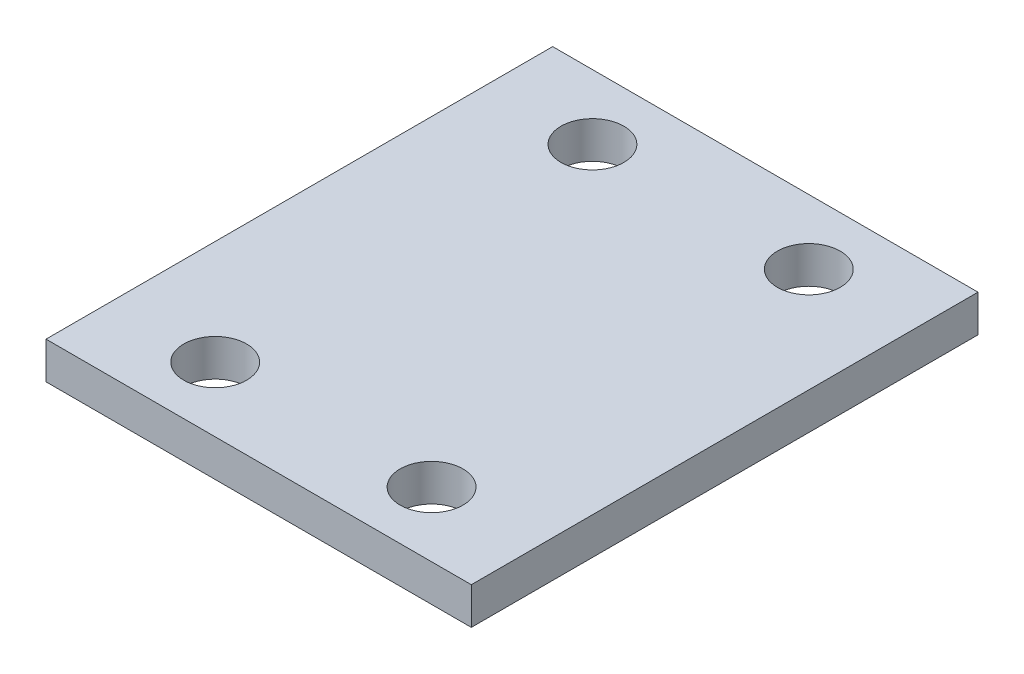
ISO-10303-21;
HEADER;
FILE_DESCRIPTION(('STEP AP214'),'2;1');
FILE_NAME('part.step','',(''),(''),'','','');
FILE_SCHEMA(('AUTOMOTIVE_DESIGN { 1 0 10303 214 1 1 1 1 }'));
ENDSEC;
DATA;
#1=APPLICATION_CONTEXT('core data for automotive mechanical design processes');
#2=APPLICATION_PROTOCOL_DEFINITION('international standard','automotive_design',2000,#1);
#3=PRODUCT_CONTEXT('',#1,'mechanical');
#4=PRODUCT('Part','Part','',(#3));
#5=PRODUCT_RELATED_PRODUCT_CATEGORY('part','',(#4));
#6=PRODUCT_DEFINITION_FORMATION('','',#4);
#7=PRODUCT_DEFINITION_CONTEXT('part definition',#1,'design');
#8=PRODUCT_DEFINITION('design','',#6,#7);
#9=PRODUCT_DEFINITION_SHAPE('','',#8);
#10=(LENGTH_UNIT() NAMED_UNIT(*) SI_UNIT(.MILLI.,.METRE.));
#11=(NAMED_UNIT(*) PLANE_ANGLE_UNIT() SI_UNIT($,.RADIAN.));
#12=(NAMED_UNIT(*) SI_UNIT($,.STERADIAN.) SOLID_ANGLE_UNIT());
#13=UNCERTAINTY_MEASURE_WITH_UNIT(LENGTH_MEASURE(1.E-05),#10,'distance_accuracy_value','');
#14=(GEOMETRIC_REPRESENTATION_CONTEXT(3) GLOBAL_UNCERTAINTY_ASSIGNED_CONTEXT((#13)) GLOBAL_UNIT_ASSIGNED_CONTEXT((#10,
#11,#12)) REPRESENTATION_CONTEXT('',''));
#15=CARTESIAN_POINT('',(0.,0.,0.));
#16=DIRECTION('',(0.,0.,1.));
#17=DIRECTION('',(1.,0.,0.));
#18=AXIS2_PLACEMENT_3D('',#15,#16,#17);
#19=CARTESIAN_POINT('',(11.5,-2.,0.));
#20=DIRECTION('',(-1.,0.,0.));
#21=DIRECTION('',(0.,0.,1.));
#22=AXIS2_PLACEMENT_3D('',#19,#20,#21);
#23=PLANE('',#22);
#24=DIRECTION('',(0.,0.,1.));
#25=VECTOR('',#24,1.);
#26=CARTESIAN_POINT('',(11.5,0.,0.));
#27=LINE('',#26,#25);
#28=CARTESIAN_POINT('',(11.5,0.,-13.7));
#29=VERTEX_POINT('',#28);
#30=CARTESIAN_POINT('',(11.5,0.,13.7));
#31=VERTEX_POINT('',#30);
#32=EDGE_CURVE('E127',#29,#31,#27,.T.);
#33=ORIENTED_EDGE('',*,*,#32,.T.);
#34=DIRECTION('',(0.,1.,0.));
#35=VECTOR('',#34,1.);
#36=CARTESIAN_POINT('',(11.5,-2.,13.7));
#37=LINE('',#36,#35);
#38=CARTESIAN_POINT('',(11.5,-2.,13.7));
#39=VERTEX_POINT('',#38);
#40=EDGE_CURVE('E11',#39,#31,#37,.T.);
#41=ORIENTED_EDGE('',*,*,#40,.F.);
#42=DIRECTION('',(0.,0.,1.));
#43=VECTOR('',#42,1.);
#44=CARTESIAN_POINT('',(11.5,-2.,0.));
#45=LINE('',#44,#43);
#46=CARTESIAN_POINT('',(11.5,-2.,-13.7));
#47=VERTEX_POINT('',#46);
#48=EDGE_CURVE('E62',#47,#39,#45,.T.);
#49=ORIENTED_EDGE('',*,*,#48,.F.);
#50=DIRECTION('',(0.,1.,0.));
#51=VECTOR('',#50,1.);
#52=CARTESIAN_POINT('',(11.5,-2.,-13.7));
#53=LINE('',#52,#51);
#54=EDGE_CURVE('E47',#47,#29,#53,.T.);
#55=ORIENTED_EDGE('',*,*,#54,.T.);
#56=EDGE_LOOP('',(#33,#41,#49,#55));
#57=FACE_BOUND('',#56,.T.);
#58=ADVANCED_FACE('F43',(#57),#23,.F.);
#59=CARTESIAN_POINT('',(0.,-2.,13.7));
#60=DIRECTION('',(0.,0.,1.));
#61=DIRECTION('',(1.,0.,0.));
#62=AXIS2_PLACEMENT_3D('',#59,#60,#61);
#63=PLANE('',#62);
#64=DIRECTION('',(1.,0.,0.));
#65=VECTOR('',#64,1.);
#66=CARTESIAN_POINT('',(0.,0.,13.7));
#67=LINE('',#66,#65);
#68=CARTESIAN_POINT('',(-11.5,0.,13.7));
#69=VERTEX_POINT('',#68);
#70=EDGE_CURVE('E135',#69,#31,#67,.T.);
#71=ORIENTED_EDGE('',*,*,#70,.F.);
#72=DIRECTION('',(0.,1.,0.));
#73=VECTOR('',#72,1.);
#74=CARTESIAN_POINT('',(-11.5,-2.,13.7));
#75=LINE('',#74,#73);
#76=CARTESIAN_POINT('',(-11.5,-2.,13.7));
#77=VERTEX_POINT('',#76);
#78=EDGE_CURVE('E53',#77,#69,#75,.T.);
#79=ORIENTED_EDGE('',*,*,#78,.F.);
#80=DIRECTION('',(1.,0.,0.));
#81=VECTOR('',#80,1.);
#82=CARTESIAN_POINT('',(0.,-2.,13.7));
#83=LINE('',#82,#81);
#84=EDGE_CURVE('E106',#77,#39,#83,.T.);
#85=ORIENTED_EDGE('',*,*,#84,.T.);
#86=ORIENTED_EDGE('',*,*,#40,.T.);
#87=EDGE_LOOP('',(#71,#79,#85,#86));
#88=FACE_BOUND('',#87,.T.);
#89=ADVANCED_FACE('F182',(#88),#63,.T.);
#90=CARTESIAN_POINT('',(-11.5,-2.,0.));
#91=DIRECTION('',(-1.,0.,0.));
#92=DIRECTION('',(0.,0.,1.));
#93=AXIS2_PLACEMENT_3D('',#90,#91,#92);
#94=PLANE('',#93);
#95=DIRECTION('',(0.,0.,1.));
#96=VECTOR('',#95,1.);
#97=CARTESIAN_POINT('',(-11.5,0.,0.));
#98=LINE('',#97,#96);
#99=CARTESIAN_POINT('',(-11.5,0.,-13.7));
#100=VERTEX_POINT('',#99);
#101=EDGE_CURVE('E96',#100,#69,#98,.T.);
#102=ORIENTED_EDGE('',*,*,#101,.F.);
#103=DIRECTION('',(0.,1.,0.));
#104=VECTOR('',#103,1.);
#105=CARTESIAN_POINT('',(-11.5,-2.,-13.7));
#106=LINE('',#105,#104);
#107=CARTESIAN_POINT('',(-11.5,-2.,-13.7));
#108=VERTEX_POINT('',#107);
#109=EDGE_CURVE('E93',#108,#100,#106,.T.);
#110=ORIENTED_EDGE('',*,*,#109,.F.);
#111=DIRECTION('',(0.,0.,1.));
#112=VECTOR('',#111,1.);
#113=CARTESIAN_POINT('',(-11.5,-2.,0.));
#114=LINE('',#113,#112);
#115=EDGE_CURVE('E95',#108,#77,#114,.T.);
#116=ORIENTED_EDGE('',*,*,#115,.T.);
#117=ORIENTED_EDGE('',*,*,#78,.T.);
#118=EDGE_LOOP('',(#102,#110,#116,#117));
#119=FACE_BOUND('',#118,.T.);
#120=ADVANCED_FACE('F94',(#119),#94,.T.);
#121=CARTESIAN_POINT('',(5.84999999999998,-2.,10.2));
#122=DIRECTION('',(0.,1.,0.));
#123=DIRECTION('',(0.,0.,1.));
#124=AXIS2_PLACEMENT_3D('',#121,#122,#123);
#125=CYLINDRICAL_SURFACE('',#124,1.7);
#126=CARTESIAN_POINT('',(5.84999999999998,-2.,10.2));
#127=DIRECTION('',(0.,1.,0.));
#128=DIRECTION('',(0.,0.,1.));
#129=AXIS2_PLACEMENT_3D('',#126,#127,#128);
#130=CIRCLE('',#129,1.7);
#131=CARTESIAN_POINT('',(5.84999999999998,-2.,11.9));
#132=VERTEX_POINT('',#131);
#133=EDGE_CURVE('E110',#132,#132,#130,.T.);
#134=ORIENTED_EDGE('',*,*,#133,.F.);
#135=EDGE_LOOP('',(#134));
#136=FACE_BOUND('',#135,.T.);
#137=CARTESIAN_POINT('',(5.84999999999998,0.,10.2));
#138=DIRECTION('',(0.,1.,0.));
#139=DIRECTION('',(0.,0.,1.));
#140=AXIS2_PLACEMENT_3D('',#137,#138,#139);
#141=CIRCLE('',#140,1.7);
#142=CARTESIAN_POINT('',(5.84999999999998,0.,11.9));
#143=VERTEX_POINT('',#142);
#144=EDGE_CURVE('E138',#143,#143,#141,.T.);
#145=ORIENTED_EDGE('',*,*,#144,.T.);
#146=EDGE_LOOP('',(#145));
#147=FACE_BOUND('',#146,.T.);
#148=ADVANCED_FACE('F173',(#136,#147),#125,.F.);
#149=CARTESIAN_POINT('',(0.,-2.,-13.7));
#150=DIRECTION('',(0.,0.,1.));
#151=DIRECTION('',(1.,0.,0.));
#152=AXIS2_PLACEMENT_3D('',#149,#150,#151);
#153=PLANE('',#152);
#154=DIRECTION('',(1.,0.,0.));
#155=VECTOR('',#154,1.);
#156=CARTESIAN_POINT('',(0.,0.,-13.7));
#157=LINE('',#156,#155);
#158=EDGE_CURVE('E130',#100,#29,#157,.T.);
#159=ORIENTED_EDGE('',*,*,#158,.T.);
#160=ORIENTED_EDGE('',*,*,#54,.F.);
#161=DIRECTION('',(1.,0.,0.));
#162=VECTOR('',#161,1.);
#163=CARTESIAN_POINT('',(0.,-2.,-13.7));
#164=LINE('',#163,#162);
#165=EDGE_CURVE('E89',#108,#47,#164,.T.);
#166=ORIENTED_EDGE('',*,*,#165,.F.);
#167=ORIENTED_EDGE('',*,*,#109,.T.);
#168=EDGE_LOOP('',(#159,#160,#166,#167));
#169=FACE_BOUND('',#168,.T.);
#170=ADVANCED_FACE('F100',(#169),#153,.F.);
#171=CARTESIAN_POINT('',(-5.85,-2.,-10.2));
#172=DIRECTION('',(0.,1.,0.));
#173=DIRECTION('',(0.,0.,1.));
#174=AXIS2_PLACEMENT_3D('',#171,#172,#173);
#175=CYLINDRICAL_SURFACE('',#174,1.7);
#176=CARTESIAN_POINT('',(-5.85,-2.,-10.2));
#177=DIRECTION('',(0.,1.,0.));
#178=DIRECTION('',(0.,0.,1.));
#179=AXIS2_PLACEMENT_3D('',#176,#177,#178);
#180=CIRCLE('',#179,1.7);
#181=CARTESIAN_POINT('',(-5.85,-2.,-8.5));
#182=VERTEX_POINT('',#181);
#183=EDGE_CURVE('E149',#182,#182,#180,.T.);
#184=ORIENTED_EDGE('',*,*,#183,.F.);
#185=EDGE_LOOP('',(#184));
#186=FACE_BOUND('',#185,.T.);
#187=CARTESIAN_POINT('',(-5.85,0.,-10.2));
#188=DIRECTION('',(0.,1.,0.));
#189=DIRECTION('',(0.,0.,1.));
#190=AXIS2_PLACEMENT_3D('',#187,#188,#189);
#191=CIRCLE('',#190,1.7);
#192=CARTESIAN_POINT('',(-5.85,0.,-8.5));
#193=VERTEX_POINT('',#192);
#194=EDGE_CURVE('E123',#193,#193,#191,.T.);
#195=ORIENTED_EDGE('',*,*,#194,.T.);
#196=EDGE_LOOP('',(#195));
#197=FACE_BOUND('',#196,.T.);
#198=ADVANCED_FACE('F159',(#186,#197),#175,.F.);
#199=CARTESIAN_POINT('',(5.84999999999999,-2.,-10.2));
#200=DIRECTION('',(0.,1.,0.));
#201=DIRECTION('',(0.,0.,1.));
#202=AXIS2_PLACEMENT_3D('',#199,#200,#201);
#203=CYLINDRICAL_SURFACE('',#202,1.7);
#204=CARTESIAN_POINT('',(5.84999999999999,-2.,-10.2));
#205=DIRECTION('',(0.,1.,0.));
#206=DIRECTION('',(0.,0.,1.));
#207=AXIS2_PLACEMENT_3D('',#204,#205,#206);
#208=CIRCLE('',#207,1.7);
#209=CARTESIAN_POINT('',(5.84999999999999,-2.,-8.49999999999999));
#210=VERTEX_POINT('',#209);
#211=EDGE_CURVE('E143',#210,#210,#208,.F.);
#212=ORIENTED_EDGE('',*,*,#211,.T.);
#213=EDGE_LOOP('',(#212));
#214=FACE_BOUND('',#213,.T.);
#215=CARTESIAN_POINT('',(5.84999999999999,0.,-10.2));
#216=DIRECTION('',(0.,1.,0.));
#217=DIRECTION('',(0.,0.,1.));
#218=AXIS2_PLACEMENT_3D('',#215,#216,#217);
#219=CIRCLE('',#218,1.7);
#220=CARTESIAN_POINT('',(5.84999999999999,0.,-8.49999999999999));
#221=VERTEX_POINT('',#220);
#222=EDGE_CURVE('E119',#221,#221,#219,.F.);
#223=ORIENTED_EDGE('',*,*,#222,.F.);
#224=EDGE_LOOP('',(#223));
#225=FACE_BOUND('',#224,.T.);
#226=ADVANCED_FACE('F45',(#214,#225),#203,.F.);
#227=CARTESIAN_POINT('',(-5.85000000000001,-2.,10.2));
#228=DIRECTION('',(0.,1.,0.));
#229=DIRECTION('',(0.,0.,1.));
#230=AXIS2_PLACEMENT_3D('',#227,#228,#229);
#231=CYLINDRICAL_SURFACE('',#230,1.7);
#232=CARTESIAN_POINT('',(-5.85000000000001,-2.,10.2));
#233=DIRECTION('',(0.,1.,0.));
#234=DIRECTION('',(0.,0.,1.));
#235=AXIS2_PLACEMENT_3D('',#232,#233,#234);
#236=CIRCLE('',#235,1.7);
#237=CARTESIAN_POINT('',(-5.85000000000001,-2.,11.9));
#238=VERTEX_POINT('',#237);
#239=EDGE_CURVE('E116',#238,#238,#236,.F.);
#240=ORIENTED_EDGE('',*,*,#239,.T.);
#241=EDGE_LOOP('',(#240));
#242=FACE_BOUND('',#241,.T.);
#243=CARTESIAN_POINT('',(-5.85000000000001,0.,10.2));
#244=DIRECTION('',(0.,1.,0.));
#245=DIRECTION('',(0.,0.,1.));
#246=AXIS2_PLACEMENT_3D('',#243,#244,#245);
#247=CIRCLE('',#246,1.7);
#248=CARTESIAN_POINT('',(-5.85000000000001,0.,11.9));
#249=VERTEX_POINT('',#248);
#250=EDGE_CURVE('E141',#249,#249,#247,.F.);
#251=ORIENTED_EDGE('',*,*,#250,.F.);
#252=EDGE_LOOP('',(#251));
#253=FACE_BOUND('',#252,.T.);
#254=ADVANCED_FACE('F229',(#242,#253),#231,.F.);
#255=CARTESIAN_POINT('',(0.,-2.,0.));
#256=DIRECTION('',(0.,1.,0.));
#257=DIRECTION('',(0.,0.,1.));
#258=AXIS2_PLACEMENT_3D('',#255,#256,#257);
#259=PLANE('',#258);
#260=ORIENTED_EDGE('',*,*,#211,.F.);
#261=EDGE_LOOP('',(#260));
#262=FACE_BOUND('',#261,.T.);
#263=ORIENTED_EDGE('',*,*,#183,.T.);
#264=EDGE_LOOP('',(#263));
#265=FACE_BOUND('',#264,.T.);
#266=ORIENTED_EDGE('',*,*,#48,.T.);
#267=ORIENTED_EDGE('',*,*,#84,.F.);
#268=ORIENTED_EDGE('',*,*,#115,.F.);
#269=ORIENTED_EDGE('',*,*,#165,.T.);
#270=EDGE_LOOP('',(#266,#267,#268,#269));
#271=FACE_BOUND('',#270,.T.);
#272=ORIENTED_EDGE('',*,*,#133,.T.);
#273=EDGE_LOOP('',(#272));
#274=FACE_BOUND('',#273,.T.);
#275=ORIENTED_EDGE('',*,*,#239,.F.);
#276=EDGE_LOOP('',(#275));
#277=FACE_BOUND('',#276,.T.);
#278=ADVANCED_FACE('F104',(#262,#265,#271,#274,#277),#259,.F.);
#279=CARTESIAN_POINT('',(0.,0.,0.));
#280=DIRECTION('',(0.,1.,0.));
#281=DIRECTION('',(0.,0.,1.));
#282=AXIS2_PLACEMENT_3D('',#279,#280,#281);
#283=PLANE('',#282);
#284=ORIENTED_EDGE('',*,*,#222,.T.);
#285=EDGE_LOOP('',(#284));
#286=FACE_BOUND('',#285,.T.);
#287=ORIENTED_EDGE('',*,*,#194,.F.);
#288=EDGE_LOOP('',(#287));
#289=FACE_BOUND('',#288,.T.);
#290=ORIENTED_EDGE('',*,*,#32,.F.);
#291=ORIENTED_EDGE('',*,*,#158,.F.);
#292=ORIENTED_EDGE('',*,*,#101,.T.);
#293=ORIENTED_EDGE('',*,*,#70,.T.);
#294=EDGE_LOOP('',(#290,#291,#292,#293));
#295=FACE_BOUND('',#294,.T.);
#296=ORIENTED_EDGE('',*,*,#144,.F.);
#297=EDGE_LOOP('',(#296));
#298=FACE_BOUND('',#297,.T.);
#299=ORIENTED_EDGE('',*,*,#250,.T.);
#300=EDGE_LOOP('',(#299));
#301=FACE_BOUND('',#300,.T.);
#302=ADVANCED_FACE('F164',(#286,#289,#295,#298,#301),#283,.T.);
#303=CLOSED_SHELL('',(#58,#89,#120,#148,#170,#198,#226,#254,#278,#302));
#304=MANIFOLD_SOLID_BREP('B2',#303);
#305=ADVANCED_BREP_SHAPE_REPRESENTATION('',(#18,#304),#14);
#306=SHAPE_DEFINITION_REPRESENTATION(#9,#305);
ENDSEC;
END-ISO-10303-21;
